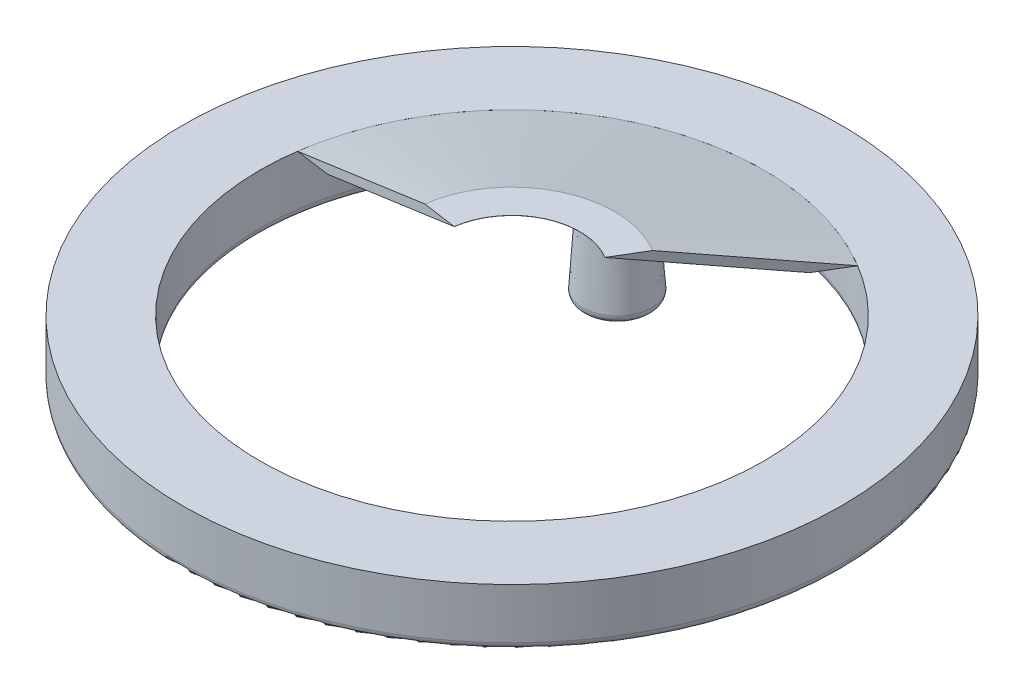
ISO-10303-21;
HEADER;
FILE_DESCRIPTION(('STEP AP214'),'2;1');
FILE_NAME('part.step','',(''),(''),'','','');
FILE_SCHEMA(('AUTOMOTIVE_DESIGN { 1 0 10303 214 1 1 1 1 }'));
ENDSEC;
DATA;
#1=APPLICATION_CONTEXT('core data for automotive mechanical design processes');
#2=APPLICATION_PROTOCOL_DEFINITION('international standard','automotive_design',2000,#1);
#3=PRODUCT_CONTEXT('',#1,'mechanical');
#4=PRODUCT('Part','Part','',(#3));
#5=PRODUCT_RELATED_PRODUCT_CATEGORY('part','',(#4));
#6=PRODUCT_DEFINITION_FORMATION('','',#4);
#7=PRODUCT_DEFINITION_CONTEXT('part definition',#1,'design');
#8=PRODUCT_DEFINITION('design','',#6,#7);
#9=PRODUCT_DEFINITION_SHAPE('','',#8);
#10=(LENGTH_UNIT() NAMED_UNIT(*) SI_UNIT(.MILLI.,.METRE.));
#11=(NAMED_UNIT(*) PLANE_ANGLE_UNIT() SI_UNIT($,.RADIAN.));
#12=(NAMED_UNIT(*) SI_UNIT($,.STERADIAN.) SOLID_ANGLE_UNIT());
#13=UNCERTAINTY_MEASURE_WITH_UNIT(LENGTH_MEASURE(1.E-05),#10,'distance_accuracy_value','');
#14=(GEOMETRIC_REPRESENTATION_CONTEXT(3) GLOBAL_UNCERTAINTY_ASSIGNED_CONTEXT((#13)) GLOBAL_UNIT_ASSIGNED_CONTEXT((#10,
#11,#12)) REPRESENTATION_CONTEXT('',''));
#15=CARTESIAN_POINT('',(0.,0.,0.));
#16=DIRECTION('',(0.,0.,1.));
#17=DIRECTION('',(1.,0.,0.));
#18=AXIS2_PLACEMENT_3D('',#15,#16,#17);
#19=CARTESIAN_POINT('',(375.043794330205,-331.500000000001,-6.11114295526433));
#20=DIRECTION('',(0.,-1.,0.));
#21=DIRECTION('',(1.,0.,0.));
#22=AXIS2_PLACEMENT_3D('',#19,#20,#21);
#23=PLANE('',#22);
#24=CARTESIAN_POINT('',(375.043794330205,-331.500000000001,-6.11114295526433));
#25=DIRECTION('',(0.,-1.,0.));
#26=DIRECTION('',(1.,0.,0.));
#27=AXIS2_PLACEMENT_3D('',#24,#25,#26);
#28=CIRCLE('',#27,6.8689886854493);
#29=CARTESIAN_POINT('',(381.912783015654,-331.500000000001,-6.11114295526433));
#30=VERTEX_POINT('',#29);
#31=EDGE_CURVE('E13',#30,#30,#28,.T.);
#32=ORIENTED_EDGE('',*,*,#31,.T.);
#33=EDGE_LOOP('',(#32));
#34=FACE_BOUND('',#33,.T.);
#35=ADVANCED_FACE('F74',(#34),#23,.T.);
#36=CARTESIAN_POINT('',(375.043794330205,-300.000000000001,-6.11114295526433));
#37=DIRECTION('',(0.,-1.,0.));
#38=DIRECTION('',(1.,0.,0.));
#39=AXIS2_PLACEMENT_3D('',#36,#37,#38);
#40=PLANE('',#39);
#41=CARTESIAN_POINT('',(375.043794330205,-300.000000000001,-6.11114295526433));
#42=DIRECTION('',(0.,-1.,0.));
#43=DIRECTION('',(1.,0.,0.));
#44=AXIS2_PLACEMENT_3D('',#41,#42,#43);
#45=CIRCLE('',#44,5.12295693941756);
#46=CARTESIAN_POINT('',(380.166751269622,-300.000000000001,-6.11114295526433));
#47=VERTEX_POINT('',#46);
#48=EDGE_CURVE('E81',#47,#47,#45,.F.);
#49=ORIENTED_EDGE('',*,*,#48,.T.);
#50=EDGE_LOOP('',(#49));
#51=FACE_BOUND('',#50,.T.);
#52=ADVANCED_FACE('F105',(#51),#40,.F.);
#53=CARTESIAN_POINT('',(375.043794330205,-300.000000000001,-6.11114295526433));
#54=DIRECTION('',(0.,-1.,0.));
#55=DIRECTION('',(1.,0.,0.));
#56=AXIS2_PLACEMENT_3D('',#53,#54,#55);
#57=CONICAL_SURFACE('',#56,6.99999999999999,0.0634069519668318);
#58=CARTESIAN_POINT('',(375.043794330205,-301.873271053635,-6.11114295526433));
#59=DIRECTION('',(0.,-1.,0.));
#60=DIRECTION('',(1.,0.,0.));
#61=AXIS2_PLACEMENT_3D('',#58,#59,#60);
#62=CIRCLE('',#61,7.11893784467519);
#63=CARTESIAN_POINT('',(382.16273217488,-301.873271053635,-6.11114295526433));
#64=VERTEX_POINT('',#63);
#65=EDGE_CURVE('E85',#64,#64,#62,.T.);
#66=ORIENTED_EDGE('',*,*,#65,.T.);
#67=EDGE_LOOP('',(#66));
#68=FACE_BOUND('',#67,.T.);
#69=CARTESIAN_POINT('',(375.043794330205,-329.373271053635,-6.11114295526433));
#70=DIRECTION('',(0.,1.,0.));
#71=DIRECTION('',(-1.,0.,0.));
#72=AXIS2_PLACEMENT_3D('',#69,#70,#71);
#73=CIRCLE('',#72,8.86496959070693);
#74=CARTESIAN_POINT('',(366.178824739498,-329.373271053635,-6.11114295526433));
#75=VERTEX_POINT('',#74);
#76=EDGE_CURVE('E89',#75,#75,#73,.T.);
#77=ORIENTED_EDGE('',*,*,#76,.T.);
#78=EDGE_LOOP('',(#77));
#79=FACE_BOUND('',#78,.T.);
#80=ADVANCED_FACE('F95',(#68,#79),#57,.T.);
#81=CARTESIAN_POINT('',(375.043794330205,-302.000000000001,-6.11114295526433));
#82=DIRECTION('',(0.,-1.,0.));
#83=DIRECTION('',(1.,0.,0.));
#84=AXIS2_PLACEMENT_3D('',#81,#82,#83);
#85=TOROIDAL_SURFACE('',#84,5.12295693941756,2.);
#86=ORIENTED_EDGE('',*,*,#48,.F.);
#87=EDGE_LOOP('',(#86));
#88=FACE_BOUND('',#87,.T.);
#89=ORIENTED_EDGE('',*,*,#65,.F.);
#90=EDGE_LOOP('',(#89));
#91=FACE_BOUND('',#90,.T.);
#92=ADVANCED_FACE('F99',(#88,#91),#85,.T.);
#93=CARTESIAN_POINT('',(375.043794330205,-329.500000000001,-6.11114295526433));
#94=DIRECTION('',(0.,-1.,0.));
#95=DIRECTION('',(1.,0.,0.));
#96=AXIS2_PLACEMENT_3D('',#93,#94,#95);
#97=TOROIDAL_SURFACE('',#96,6.8689886854493,2.);
#98=ORIENTED_EDGE('',*,*,#76,.F.);
#99=EDGE_LOOP('',(#98));
#100=FACE_BOUND('',#99,.T.);
#101=ORIENTED_EDGE('',*,*,#31,.F.);
#102=EDGE_LOOP('',(#101));
#103=FACE_BOUND('',#102,.T.);
#104=ADVANCED_FACE('F76',(#100,#103),#97,.T.);
#105=CLOSED_SHELL('',(#35,#52,#80,#92,#104));
#106=MANIFOLD_SOLID_BREP('B2',#105);
#107=CARTESIAN_POINT('',(412.000003104633,-300.000000000001,57.9999998595449));
#108=DIRECTION('',(0.,-1.,0.));
#109=DIRECTION('',(1.,0.,0.));
#110=AXIS2_PLACEMENT_3D('',#107,#108,#109);
#111=PLANE('',#110);
#112=CARTESIAN_POINT('',(412.000003104633,-300.000000000001,57.9999998595449));
#113=DIRECTION('',(0.,-1.,0.));
#114=DIRECTION('',(1.,0.,0.));
#115=AXIS2_PLACEMENT_3D('',#112,#113,#114);
#116=CIRCLE('',#115,67.);
#117=CARTESIAN_POINT('',(479.000003104633,-300.000000000001,57.9999998595449));
#118=VERTEX_POINT('',#117);
#119=EDGE_CURVE('E160',#118,#118,#116,.F.);
#120=ORIENTED_EDGE('',*,*,#119,.T.);
#121=EDGE_LOOP('',(#120));
#122=FACE_BOUND('',#121,.T.);
#123=CARTESIAN_POINT('',(412.000003104633,-300.000000000001,57.9999998595449));
#124=DIRECTION('',(0.,-1.,0.));
#125=DIRECTION('',(1.,0.,0.));
#126=AXIS2_PLACEMENT_3D('',#123,#124,#125);
#127=CIRCLE('',#126,83.);
#128=CARTESIAN_POINT('',(495.000003104633,-300.000000000001,57.9999998595449));
#129=VERTEX_POINT('',#128);
#130=EDGE_CURVE('E164',#129,#129,#127,.T.);
#131=ORIENTED_EDGE('',*,*,#130,.T.);
#132=EDGE_LOOP('',(#131));
#133=FACE_BOUND('',#132,.T.);
#134=ADVANCED_FACE('F153',(#122,#133),#111,.T.);
#135=CARTESIAN_POINT('',(412.000003104633,-285.000000000001,57.9999998595449));
#136=DIRECTION('',(0.,-1.,0.));
#137=DIRECTION('',(1.,0.,0.));
#138=AXIS2_PLACEMENT_3D('',#135,#136,#137);
#139=PLANE('',#138);
#140=CARTESIAN_POINT('',(412.000003104633,-285.000000000001,57.9999998595449));
#141=DIRECTION('',(0.,-1.,0.));
#142=DIRECTION('',(1.,0.,0.));
#143=AXIS2_PLACEMENT_3D('',#140,#141,#142);
#144=CIRCLE('',#143,85.);
#145=CARTESIAN_POINT('',(497.000003104633,-285.000000000001,57.9999998595449));
#146=VERTEX_POINT('',#145);
#147=EDGE_CURVE('E173',#146,#146,#144,.T.);
#148=ORIENTED_EDGE('',*,*,#147,.F.);
#149=EDGE_LOOP('',(#148));
#150=FACE_BOUND('',#149,.T.);
#151=CARTESIAN_POINT('',(412.000003104633,-285.000000000001,57.9999998595449));
#152=DIRECTION('',(0.,-1.,0.));
#153=DIRECTION('',(1.,0.,0.));
#154=AXIS2_PLACEMENT_3D('',#151,#152,#153);
#155=CIRCLE('',#154,65.);
#156=CARTESIAN_POINT('',(477.000003104633,-285.000000000001,57.9999998595449));
#157=VERTEX_POINT('',#156);
#158=EDGE_CURVE('E176',#157,#157,#155,.T.);
#159=ORIENTED_EDGE('',*,*,#158,.T.);
#160=EDGE_LOOP('',(#159));
#161=FACE_BOUND('',#160,.T.);
#162=ADVANCED_FACE('F180',(#150,#161),#139,.F.);
#163=CARTESIAN_POINT('',(412.000003104633,-300.000000000001,57.9999998595449));
#164=DIRECTION('',(0.,1.,0.));
#165=DIRECTION('',(-1.,0.,0.));
#166=AXIS2_PLACEMENT_3D('',#163,#164,#165);
#167=CYLINDRICAL_SURFACE('',#166,85.);
#168=CARTESIAN_POINT('',(412.000003104633,-298.000000000001,57.9999998595449));
#169=DIRECTION('',(0.,-1.,0.));
#170=DIRECTION('',(1.,0.,0.));
#171=AXIS2_PLACEMENT_3D('',#168,#169,#170);
#172=CIRCLE('',#171,85.);
#173=CARTESIAN_POINT('',(497.000003104633,-298.000000000001,57.9999998595449));
#174=VERTEX_POINT('',#173);
#175=EDGE_CURVE('E73',#174,#174,#172,.F.);
#176=ORIENTED_EDGE('',*,*,#175,.T.);
#177=EDGE_LOOP('',(#176));
#178=FACE_BOUND('',#177,.T.);
#179=ORIENTED_EDGE('',*,*,#147,.T.);
#180=EDGE_LOOP('',(#179));
#181=FACE_BOUND('',#180,.T.);
#182=ADVANCED_FACE('F185',(#178,#181),#167,.T.);
#183=CARTESIAN_POINT('',(412.000003104633,-300.000000000001,57.9999998595449));
#184=DIRECTION('',(0.,1.,0.));
#185=DIRECTION('',(-1.,0.,0.));
#186=AXIS2_PLACEMENT_3D('',#183,#184,#185);
#187=CYLINDRICAL_SURFACE('',#186,65.);
#188=CARTESIAN_POINT('',(412.000003104633,-298.000000000001,57.9999998595449));
#189=DIRECTION('',(0.,-1.,0.));
#190=DIRECTION('',(1.,0.,0.));
#191=AXIS2_PLACEMENT_3D('',#188,#189,#190);
#192=CIRCLE('',#191,65.);
#193=CARTESIAN_POINT('',(477.000003104633,-298.000000000001,57.9999998595449));
#194=VERTEX_POINT('',#193);
#195=EDGE_CURVE('E168',#194,#194,#192,.T.);
#196=ORIENTED_EDGE('',*,*,#195,.T.);
#197=EDGE_LOOP('',(#196));
#198=FACE_BOUND('',#197,.T.);
#199=ORIENTED_EDGE('',*,*,#158,.F.);
#200=EDGE_LOOP('',(#199));
#201=FACE_BOUND('',#200,.T.);
#202=ADVANCED_FACE('F182',(#198,#201),#187,.F.);
#203=CARTESIAN_POINT('',(412.000003104633,-298.000000000001,57.9999998595449));
#204=DIRECTION('',(0.,-1.,0.));
#205=DIRECTION('',(1.,0.,0.));
#206=AXIS2_PLACEMENT_3D('',#203,#204,#205);
#207=TOROIDAL_SURFACE('',#206,67.,2.);
#208=ORIENTED_EDGE('',*,*,#119,.F.);
#209=EDGE_LOOP('',(#208));
#210=FACE_BOUND('',#209,.T.);
#211=ORIENTED_EDGE('',*,*,#195,.F.);
#212=EDGE_LOOP('',(#211));
#213=FACE_BOUND('',#212,.T.);
#214=ADVANCED_FACE('F184',(#210,#213),#207,.T.);
#215=CARTESIAN_POINT('',(412.000003104633,-298.000000000001,57.9999998595449));
#216=DIRECTION('',(0.,-1.,0.));
#217=DIRECTION('',(1.,0.,0.));
#218=AXIS2_PLACEMENT_3D('',#215,#216,#217);
#219=TOROIDAL_SURFACE('',#218,83.,2.);
#220=ORIENTED_EDGE('',*,*,#175,.F.);
#221=EDGE_LOOP('',(#220));
#222=FACE_BOUND('',#221,.T.);
#223=ORIENTED_EDGE('',*,*,#130,.F.);
#224=EDGE_LOOP('',(#223));
#225=FACE_BOUND('',#224,.T.);
#226=ADVANCED_FACE('F155',(#222,#225),#219,.T.);
#227=CLOSED_SHELL('',(#134,#162,#182,#202,#214,#226));
#228=MANIFOLD_SOLID_BREP('B8',#227);
#229=CARTESIAN_POINT('',(412.000003104633,-285.000000000001,57.9999998595449));
#230=DIRECTION('',(0.,-1.,0.));
#231=DIRECTION('',(1.,0.,0.));
#232=AXIS2_PLACEMENT_3D('',#229,#230,#231);
#233=CONICAL_SURFACE('',#232,65.,1.31705533854131);
#234=CARTESIAN_POINT('',(412.000003104633,-275.000000000001,57.9999998595447));
#235=DIRECTION('',(0.,-1.,0.));
#236=DIRECTION('',(0.,0.,-1.));
#237=AXIS2_PLACEMENT_3D('',#234,#235,#236);
#238=CIRCLE('',#237,26.4391895186664);
#239=CARTESIAN_POINT('',(425.617189715319,-275.000000000001,35.337189548074));
#240=VERTEX_POINT('',#239);
#241=CARTESIAN_POINT('',(385.81811752881,-275.000000000001,54.3203789417806));
#242=VERTEX_POINT('',#241);
#243=EDGE_CURVE('E289',#240,#242,#238,.F.);
#244=ORIENTED_EDGE('',*,*,#243,.F.);
#245=DIRECTION('',(-0.498546611690011,0.251026909581981,0.829720896831055));
#246=VECTOR('',#245,1.);
#247=CARTESIAN_POINT('',(421.013166754369,-272.681794182467,42.9995704982535));
#248=LINE('',#247,#246);
#249=CARTESIAN_POINT('',(445.477475312597,-285.000000000001,2.28412371490311));
#250=VERTEX_POINT('',#249);
#251=EDGE_CURVE('E294',#250,#240,#248,.T.);
#252=ORIENTED_EDGE('',*,*,#251,.F.);
#253=CARTESIAN_POINT('',(412.000003104633,-285.000000000001,57.9999998595449));
#254=DIRECTION('',(0.,-1.,0.));
#255=DIRECTION('',(1.,0.,0.));
#256=AXIS2_PLACEMENT_3D('',#253,#254,#255);
#257=CIRCLE('',#256,65.);
#258=CARTESIAN_POINT('',(347.63257820435,-285.000000000001,48.9537513715601));
#259=VERTEX_POINT('',#258);
#260=EDGE_CURVE('E265',#259,#250,#257,.T.);
#261=ORIENTED_EDGE('',*,*,#260,.F.);
#262=DIRECTION('',(0.95855979273404,0.251026909581979,0.13471679338299));
#263=VECTOR('',#262,1.);
#264=CARTESIAN_POINT('',(394.670311469574,-272.681794182467,55.564473667163));
#265=LINE('',#264,#263);
#266=EDGE_CURVE('E296',#259,#242,#265,.T.);
#267=ORIENTED_EDGE('',*,*,#266,.T.);
#268=EDGE_LOOP('',(#244,#252,#261,#267));
#269=FACE_BOUND('',#268,.T.);
#270=ADVANCED_FACE('F244',(#269),#233,.T.);
#271=CARTESIAN_POINT('',(412.000003104633,-275.000000000001,57.9999998595449));
#272=DIRECTION('',(0.,-1.,0.));
#273=DIRECTION('',(1.,0.,0.));
#274=AXIS2_PLACEMENT_3D('',#271,#272,#273);
#275=CYLINDRICAL_SURFACE('',#274,17.5000000000002);
#276=DIRECTION('',(0.,-1.,0.));
#277=VECTOR('',#276,1.);
#278=CARTESIAN_POINT('',(421.013166754369,-275.023695570746,42.9995704982535));
#279=LINE('',#278,#277);
#280=CARTESIAN_POINT('',(421.013166754369,-275.000000000001,42.9995704982537));
#281=VERTEX_POINT('',#280);
#282=CARTESIAN_POINT('',(421.013166754369,-275.023695570746,42.9995704982535));
#283=VERTEX_POINT('',#282);
#284=EDGE_CURVE('E303',#281,#283,#279,.T.);
#285=ORIENTED_EDGE('',*,*,#284,.F.);
#286=CARTESIAN_POINT('',(412.000003104633,-275.000000000001,57.9999998595449));
#287=DIRECTION('',(0.,-1.,0.));
#288=DIRECTION('',(1.,0.,0.));
#289=AXIS2_PLACEMENT_3D('',#286,#287,#288);
#290=CIRCLE('',#289,17.5);
#291=CARTESIAN_POINT('',(394.670311469574,-275.000000000001,55.564473667163));
#292=VERTEX_POINT('',#291);
#293=EDGE_CURVE('E252',#292,#281,#290,.T.);
#294=ORIENTED_EDGE('',*,*,#293,.F.);
#295=DIRECTION('',(0.,-1.,0.));
#296=VECTOR('',#295,1.);
#297=CARTESIAN_POINT('',(394.670311469574,-275.023695570746,55.564473667163));
#298=LINE('',#297,#296);
#299=CARTESIAN_POINT('',(394.670311469574,-275.023695570746,55.564473667163));
#300=VERTEX_POINT('',#299);
#301=EDGE_CURVE('E312',#292,#300,#298,.T.);
#302=ORIENTED_EDGE('',*,*,#301,.T.);
#303=CARTESIAN_POINT('',(412.000003104633,-275.023695570746,57.9999998595449));
#304=DIRECTION('',(0.,-1.,0.));
#305=DIRECTION('',(1.,0.,0.));
#306=AXIS2_PLACEMENT_3D('',#303,#304,#305);
#307=CIRCLE('',#306,17.5000000000002);
#308=EDGE_CURVE('E323',#300,#283,#307,.T.);
#309=ORIENTED_EDGE('',*,*,#308,.T.);
#310=EDGE_LOOP('',(#285,#294,#302,#309));
#311=FACE_BOUND('',#310,.T.);
#312=ADVANCED_FACE('F246',(#311),#275,.F.);
#313=CARTESIAN_POINT('',(412.000003104633,-275.023695570746,57.9999998595449));
#314=DIRECTION('',(0.,-1.,0.));
#315=DIRECTION('',(1.,0.,0.));
#316=AXIS2_PLACEMENT_3D('',#313,#314,#315);
#317=CONICAL_SURFACE('',#316,17.5000000000002,1.31705533854133);
#318=CARTESIAN_POINT('',(412.000003104633,-285.,57.9999998595449));
#319=DIRECTION('',(0.,-1.,0.));
#320=DIRECTION('',(1.,0.,0.));
#321=AXIS2_PLACEMENT_3D('',#318,#319,#320);
#322=CIRCLE('',#321,55.9694384400567);
#323=CARTESIAN_POINT('',(356.575254959967,-285.,50.2105626272681));
#324=VERTEX_POINT('',#323);
#325=CARTESIAN_POINT('',(440.826392271407,-285.,10.024825791064));
#326=VERTEX_POINT('',#325);
#327=EDGE_CURVE('E321',#324,#326,#322,.T.);
#328=ORIENTED_EDGE('',*,*,#327,.T.);
#329=DIRECTION('',(0.498546611690013,-0.251026909581961,-0.829720896831059));
#330=VECTOR('',#329,1.);
#331=CARTESIAN_POINT('',(440.826392271407,-285.,10.024825791064));
#332=LINE('',#331,#330);
#333=EDGE_CURVE('E305',#283,#326,#332,.T.);
#334=ORIENTED_EDGE('',*,*,#333,.F.);
#335=ORIENTED_EDGE('',*,*,#308,.F.);
#336=DIRECTION('',(-0.958559792734045,-0.251026909581959,-0.134716793382991));
#337=VECTOR('',#336,1.);
#338=CARTESIAN_POINT('',(356.575254959967,-285.,50.2105626272681));
#339=LINE('',#338,#337);
#340=EDGE_CURVE('E314',#300,#324,#339,.T.);
#341=ORIENTED_EDGE('',*,*,#340,.T.);
#342=EDGE_LOOP('',(#328,#334,#335,#341));
#343=FACE_BOUND('',#342,.T.);
#344=ADVANCED_FACE('F331',(#343),#317,.F.);
#345=CARTESIAN_POINT('',(347.63257820435,-285.,48.9537513715601));
#346=DIRECTION('',(0.,-1.,0.));
#347=DIRECTION('',(1.,0.,0.));
#348=AXIS2_PLACEMENT_3D('',#345,#346,#347);
#349=PLANE('',#348);
#350=DIRECTION('',(-0.990268068741571,0.,-0.139173100960062));
#351=VECTOR('',#350,1.);
#352=CARTESIAN_POINT('',(347.63257820435,-285.000000000001,48.9537513715601));
#353=LINE('',#352,#351);
#354=EDGE_CURVE('E317',#324,#259,#353,.T.);
#355=ORIENTED_EDGE('',*,*,#354,.T.);
#356=ORIENTED_EDGE('',*,*,#260,.T.);
#357=DIRECTION('',(0.515038074910054,0.,-0.857167300702112));
#358=VECTOR('',#357,1.);
#359=CARTESIAN_POINT('',(445.477475312597,-285.000000000001,2.28412371490311));
#360=LINE('',#359,#358);
#361=EDGE_CURVE('E302',#326,#250,#360,.T.);
#362=ORIENTED_EDGE('',*,*,#361,.F.);
#363=ORIENTED_EDGE('',*,*,#327,.F.);
#364=EDGE_LOOP('',(#355,#356,#362,#363));
#365=FACE_BOUND('',#364,.T.);
#366=ADVANCED_FACE('F333',(#365),#349,.T.);
#367=CARTESIAN_POINT('',(354.564454824629,1.14968595562553E-13,49.9279630978285));
#368=DIRECTION('',(0.139173100960062,0.,-0.990268068741571));
#369=DIRECTION('',(-0.990268068741571,0.,-0.139173100960062));
#370=AXIS2_PLACEMENT_3D('',#367,#368,#369);
#371=PLANE('',#370);
#372=ORIENTED_EDGE('',*,*,#301,.F.);
#373=DIRECTION('',(-0.990268068741571,0.,-0.139173100960062));
#374=VECTOR('',#373,1.);
#375=CARTESIAN_POINT('',(354.564454824629,-275.000000000001,49.9279630978282));
#376=LINE('',#375,#374);
#377=EDGE_CURVE('E297',#292,#242,#376,.T.);
#378=ORIENTED_EDGE('',*,*,#377,.T.);
#379=ORIENTED_EDGE('',*,*,#266,.F.);
#380=ORIENTED_EDGE('',*,*,#354,.F.);
#381=ORIENTED_EDGE('',*,*,#340,.F.);
#382=EDGE_LOOP('',(#372,#378,#379,#380,#381));
#383=FACE_BOUND('',#382,.T.);
#384=ADVANCED_FACE('F336',(#383),#371,.F.);
#385=CARTESIAN_POINT('',(441.872208715887,0.,8.28429494021124));
#386=DIRECTION('',(0.857167300702112,0.,0.515038074910054));
#387=DIRECTION('',(0.515038074910054,0.,-0.857167300702112));
#388=AXIS2_PLACEMENT_3D('',#385,#386,#387);
#389=PLANE('',#388);
#390=DIRECTION('',(0.515038074910054,0.,-0.857167300702112));
#391=VECTOR('',#390,1.);
#392=CARTESIAN_POINT('',(441.872208715887,-275.000000000001,8.28429494021127));
#393=LINE('',#392,#391);
#394=EDGE_CURVE('E151',#281,#240,#393,.T.);
#395=ORIENTED_EDGE('',*,*,#394,.F.);
#396=ORIENTED_EDGE('',*,*,#284,.T.);
#397=ORIENTED_EDGE('',*,*,#333,.T.);
#398=ORIENTED_EDGE('',*,*,#361,.T.);
#399=ORIENTED_EDGE('',*,*,#251,.T.);
#400=EDGE_LOOP('',(#395,#396,#397,#398,#399));
#401=FACE_BOUND('',#400,.T.);
#402=ADVANCED_FACE('F299',(#401),#389,.T.);
#403=CARTESIAN_POINT('',(188.256947974271,-275.000000000001,-482.));
#404=DIRECTION('',(0.,-1.,0.));
#405=DIRECTION('',(0.,0.,-1.));
#406=AXIS2_PLACEMENT_3D('',#403,#404,#405);
#407=PLANE('',#406);
#408=ORIENTED_EDGE('',*,*,#293,.T.);
#409=ORIENTED_EDGE('',*,*,#394,.T.);
#410=ORIENTED_EDGE('',*,*,#243,.T.);
#411=ORIENTED_EDGE('',*,*,#377,.F.);
#412=EDGE_LOOP('',(#408,#409,#410,#411));
#413=FACE_BOUND('',#412,.T.);
#414=ADVANCED_FACE('F288',(#413),#407,.F.);
#415=CLOSED_SHELL('',(#270,#312,#344,#366,#384,#402,#414));
#416=MANIFOLD_SOLID_BREP('B68',#415);
#417=ADVANCED_BREP_SHAPE_REPRESENTATION('',(#18,#106,#228,#416),#14);
#418=SHAPE_DEFINITION_REPRESENTATION(#9,#417);
ENDSEC;
END-ISO-10303-21;
